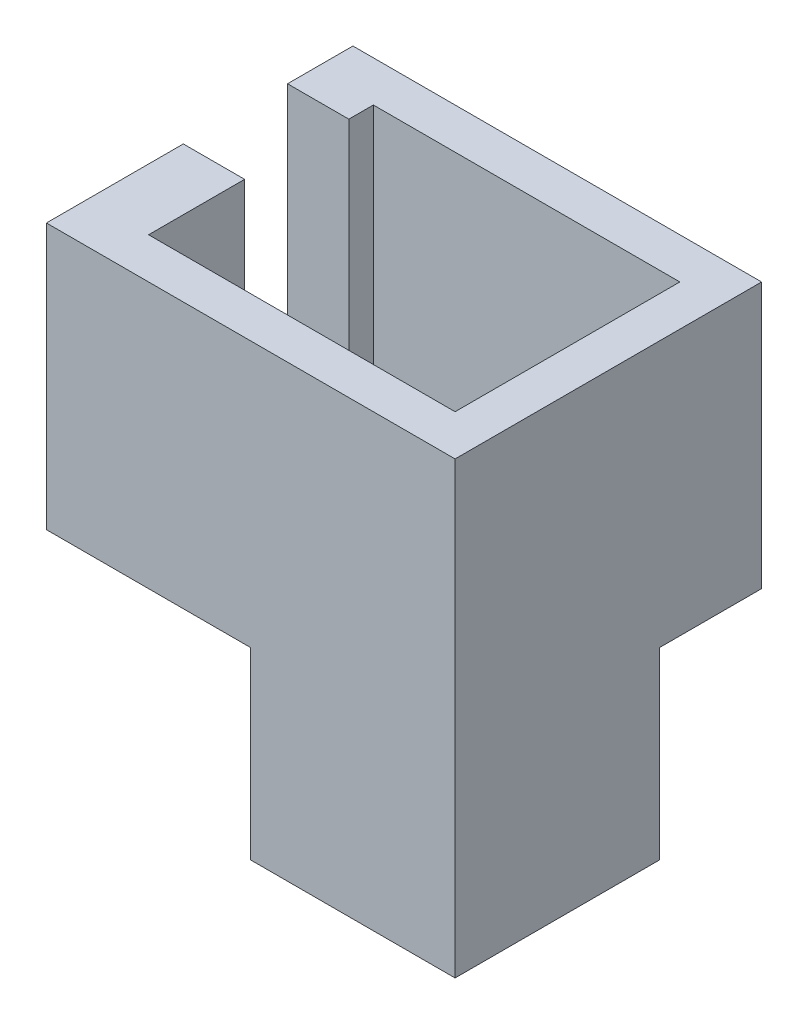
ISO-10303-21;
HEADER;
FILE_DESCRIPTION(('STEP AP214'),'2;1');
FILE_NAME('part.step','',(''),(''),'','','');
FILE_SCHEMA(('AUTOMOTIVE_DESIGN { 1 0 10303 214 1 1 1 1 }'));
ENDSEC;
DATA;
#1=APPLICATION_CONTEXT('core data for automotive mechanical design processes');
#2=APPLICATION_PROTOCOL_DEFINITION('international standard','automotive_design',2000,#1);
#3=PRODUCT_CONTEXT('',#1,'mechanical');
#4=PRODUCT('Part','Part','',(#3));
#5=PRODUCT_RELATED_PRODUCT_CATEGORY('part','',(#4));
#6=PRODUCT_DEFINITION_FORMATION('','',#4);
#7=PRODUCT_DEFINITION_CONTEXT('part definition',#1,'design');
#8=PRODUCT_DEFINITION('design','',#6,#7);
#9=PRODUCT_DEFINITION_SHAPE('','',#8);
#10=(LENGTH_UNIT() NAMED_UNIT(*) SI_UNIT(.MILLI.,.METRE.));
#11=(NAMED_UNIT(*) PLANE_ANGLE_UNIT() SI_UNIT($,.RADIAN.));
#12=(NAMED_UNIT(*) SI_UNIT($,.STERADIAN.) SOLID_ANGLE_UNIT());
#13=UNCERTAINTY_MEASURE_WITH_UNIT(LENGTH_MEASURE(1.E-05),#10,'distance_accuracy_value','');
#14=(GEOMETRIC_REPRESENTATION_CONTEXT(3) GLOBAL_UNCERTAINTY_ASSIGNED_CONTEXT((#13)) GLOBAL_UNIT_ASSIGNED_CONTEXT((#10,
#11,#12)) REPRESENTATION_CONTEXT('',''));
#15=CARTESIAN_POINT('',(0.,0.,0.));
#16=DIRECTION('',(0.,0.,1.));
#17=DIRECTION('',(1.,0.,0.));
#18=AXIS2_PLACEMENT_3D('',#15,#16,#17);
#19=CARTESIAN_POINT('',(0.,-1.,0.));
#20=DIRECTION('',(0.,1.,0.));
#21=DIRECTION('',(0.,0.,1.));
#22=AXIS2_PLACEMENT_3D('',#19,#20,#21);
#23=PLANE('',#22);
#24=DIRECTION('',(1.,0.,0.));
#25=VECTOR('',#24,1.);
#26=CARTESIAN_POINT('',(20.,-1.,-10.));
#27=LINE('',#26,#25);
#28=CARTESIAN_POINT('',(10.,-1.,-10.));
#29=VERTEX_POINT('',#28);
#30=CARTESIAN_POINT('',(20.,-1.,-10.));
#31=VERTEX_POINT('',#30);
#32=EDGE_CURVE('E162',#29,#31,#27,.T.);
#33=ORIENTED_EDGE('',*,*,#32,.F.);
#34=DIRECTION('',(0.,0.,-1.));
#35=VECTOR('',#34,1.);
#36=CARTESIAN_POINT('',(10.,-1.,0.));
#37=LINE('',#36,#35);
#38=CARTESIAN_POINT('',(10.,-1.,0.));
#39=VERTEX_POINT('',#38);
#40=EDGE_CURVE('E48',#39,#29,#37,.T.);
#41=ORIENTED_EDGE('',*,*,#40,.F.);
#42=DIRECTION('',(-1.,0.,0.));
#43=VECTOR('',#42,1.);
#44=CARTESIAN_POINT('',(20.,-1.,0.));
#45=LINE('',#44,#43);
#46=CARTESIAN_POINT('',(0.,-1.,0.));
#47=VERTEX_POINT('',#46);
#48=EDGE_CURVE('E177',#39,#47,#45,.T.);
#49=ORIENTED_EDGE('',*,*,#48,.T.);
#50=DIRECTION('',(0.,0.,-1.));
#51=VECTOR('',#50,1.);
#52=CARTESIAN_POINT('',(0.,-1.,0.));
#53=LINE('',#52,#51);
#54=CARTESIAN_POINT('',(0.,-1.,-15.));
#55=VERTEX_POINT('',#54);
#56=EDGE_CURVE('E179',#47,#55,#53,.T.);
#57=ORIENTED_EDGE('',*,*,#56,.T.);
#58=DIRECTION('',(1.,0.,0.));
#59=VECTOR('',#58,1.);
#60=CARTESIAN_POINT('',(20.,-1.,-15.));
#61=LINE('',#60,#59);
#62=CARTESIAN_POINT('',(20.,-1.,-15.));
#63=VERTEX_POINT('',#62);
#64=EDGE_CURVE('E182',#55,#63,#61,.T.);
#65=ORIENTED_EDGE('',*,*,#64,.T.);
#66=DIRECTION('',(0.,0.,1.));
#67=VECTOR('',#66,1.);
#68=CARTESIAN_POINT('',(20.,-1.,0.));
#69=LINE('',#68,#67);
#70=EDGE_CURVE('E54',#63,#31,#69,.T.);
#71=ORIENTED_EDGE('',*,*,#70,.T.);
#72=EDGE_LOOP('',(#33,#41,#49,#57,#65,#71));
#73=FACE_BOUND('',#72,.T.);
#74=ADVANCED_FACE('F33',(#73),#23,.F.);
#75=CARTESIAN_POINT('',(0.,12.,0.));
#76=DIRECTION('',(0.,0.,-1.));
#77=DIRECTION('',(-1.,0.,0.));
#78=AXIS2_PLACEMENT_3D('',#75,#76,#77);
#79=PLANE('',#78);
#80=DIRECTION('',(0.,-1.,0.));
#81=VECTOR('',#80,1.);
#82=CARTESIAN_POINT('',(0.,12.,0.));
#83=LINE('',#82,#81);
#84=CARTESIAN_POINT('',(0.,12.,0.));
#85=VERTEX_POINT('',#84);
#86=EDGE_CURVE('E11',#85,#47,#83,.T.);
#87=ORIENTED_EDGE('',*,*,#86,.T.);
#88=ORIENTED_EDGE('',*,*,#48,.F.);
#89=DIRECTION('',(0.,1.,0.));
#90=VECTOR('',#89,1.);
#91=CARTESIAN_POINT('',(10.,-10.,0.));
#92=LINE('',#91,#90);
#93=CARTESIAN_POINT('',(10.,-10.,0.));
#94=VERTEX_POINT('',#93);
#95=EDGE_CURVE('E153',#94,#39,#92,.T.);
#96=ORIENTED_EDGE('',*,*,#95,.F.);
#97=DIRECTION('',(-1.,0.,0.));
#98=VECTOR('',#97,1.);
#99=CARTESIAN_POINT('',(20.,-10.,0.));
#100=LINE('',#99,#98);
#101=CARTESIAN_POINT('',(20.,-10.,0.));
#102=VERTEX_POINT('',#101);
#103=EDGE_CURVE('E151',#102,#94,#100,.T.);
#104=ORIENTED_EDGE('',*,*,#103,.F.);
#105=DIRECTION('',(0.,-1.,0.));
#106=VECTOR('',#105,1.);
#107=CARTESIAN_POINT('',(20.,12.,0.));
#108=LINE('',#107,#106);
#109=CARTESIAN_POINT('',(20.,12.,0.));
#110=VERTEX_POINT('',#109);
#111=EDGE_CURVE('E41',#110,#102,#108,.T.);
#112=ORIENTED_EDGE('',*,*,#111,.F.);
#113=DIRECTION('',(1.,0.,0.));
#114=VECTOR('',#113,1.);
#115=CARTESIAN_POINT('',(0.,12.,0.));
#116=LINE('',#115,#114);
#117=EDGE_CURVE('E190',#85,#110,#116,.T.);
#118=ORIENTED_EDGE('',*,*,#117,.F.);
#119=EDGE_LOOP('',(#87,#88,#96,#104,#112,#118));
#120=FACE_BOUND('',#119,.T.);
#121=ADVANCED_FACE('F35',(#120),#79,.F.);
#122=CARTESIAN_POINT('',(20.,12.,0.));
#123=DIRECTION('',(-1.,0.,0.));
#124=DIRECTION('',(0.,0.,1.));
#125=AXIS2_PLACEMENT_3D('',#122,#123,#124);
#126=PLANE('',#125);
#127=ORIENTED_EDGE('',*,*,#111,.T.);
#128=DIRECTION('',(0.,0.,1.));
#129=VECTOR('',#128,1.);
#130=CARTESIAN_POINT('',(20.,-10.,0.));
#131=LINE('',#130,#129);
#132=CARTESIAN_POINT('',(20.,-10.,-10.));
#133=VERTEX_POINT('',#132);
#134=EDGE_CURVE('E145',#133,#102,#131,.T.);
#135=ORIENTED_EDGE('',*,*,#134,.F.);
#136=DIRECTION('',(0.,1.,0.));
#137=VECTOR('',#136,1.);
#138=CARTESIAN_POINT('',(20.,-10.,-10.));
#139=LINE('',#138,#137);
#140=EDGE_CURVE('E168',#133,#31,#139,.T.);
#141=ORIENTED_EDGE('',*,*,#140,.T.);
#142=ORIENTED_EDGE('',*,*,#70,.F.);
#143=DIRECTION('',(0.,-1.,0.));
#144=VECTOR('',#143,1.);
#145=CARTESIAN_POINT('',(20.,12.,-15.));
#146=LINE('',#145,#144);
#147=CARTESIAN_POINT('',(20.,12.,-15.));
#148=VERTEX_POINT('',#147);
#149=EDGE_CURVE('E149',#148,#63,#146,.T.);
#150=ORIENTED_EDGE('',*,*,#149,.F.);
#151=DIRECTION('',(0.,0.,-1.));
#152=VECTOR('',#151,1.);
#153=CARTESIAN_POINT('',(20.,12.,0.));
#154=LINE('',#153,#152);
#155=EDGE_CURVE('E147',#110,#148,#154,.T.);
#156=ORIENTED_EDGE('',*,*,#155,.F.);
#157=EDGE_LOOP('',(#127,#135,#141,#142,#150,#156));
#158=FACE_BOUND('',#157,.T.);
#159=ADVANCED_FACE('F142',(#158),#126,.F.);
#160=CARTESIAN_POINT('',(0.,12.,-15.));
#161=DIRECTION('',(0.,0.,1.));
#162=DIRECTION('',(1.,0.,0.));
#163=AXIS2_PLACEMENT_3D('',#160,#161,#162);
#164=PLANE('',#163);
#165=ORIENTED_EDGE('',*,*,#149,.T.);
#166=ORIENTED_EDGE('',*,*,#64,.F.);
#167=DIRECTION('',(0.,-1.,0.));
#168=VECTOR('',#167,1.);
#169=CARTESIAN_POINT('',(0.,12.,-15.));
#170=LINE('',#169,#168);
#171=CARTESIAN_POINT('',(0.,12.,-15.));
#172=VERTEX_POINT('',#171);
#173=EDGE_CURVE('E255',#172,#55,#170,.T.);
#174=ORIENTED_EDGE('',*,*,#173,.F.);
#175=DIRECTION('',(-1.,0.,0.));
#176=VECTOR('',#175,1.);
#177=CARTESIAN_POINT('',(0.,12.,-15.));
#178=LINE('',#177,#176);
#179=EDGE_CURVE('E194',#148,#172,#178,.T.);
#180=ORIENTED_EDGE('',*,*,#179,.F.);
#181=EDGE_LOOP('',(#165,#166,#174,#180));
#182=FACE_BOUND('',#181,.T.);
#183=ADVANCED_FACE('F260',(#182),#164,.F.);
#184=CARTESIAN_POINT('',(0.,12.,-15.));
#185=DIRECTION('',(1.,0.,0.));
#186=DIRECTION('',(0.,0.,-1.));
#187=AXIS2_PLACEMENT_3D('',#184,#185,#186);
#188=PLANE('',#187);
#189=ORIENTED_EDGE('',*,*,#173,.T.);
#190=ORIENTED_EDGE('',*,*,#56,.F.);
#191=ORIENTED_EDGE('',*,*,#86,.F.);
#192=DIRECTION('',(0.,0.,1.));
#193=VECTOR('',#192,1.);
#194=CARTESIAN_POINT('',(0.,12.,0.));
#195=LINE('',#194,#193);
#196=CARTESIAN_POINT('',(0.,12.,-6.7));
#197=VERTEX_POINT('',#196);
#198=EDGE_CURVE('E187',#197,#85,#195,.T.);
#199=ORIENTED_EDGE('',*,*,#198,.F.);
#200=DIRECTION('',(0.,-1.,0.));
#201=VECTOR('',#200,1.);
#202=CARTESIAN_POINT('',(0.,12.,-6.7));
#203=LINE('',#202,#201);
#204=CARTESIAN_POINT('',(0.,0.,-6.7));
#205=VERTEX_POINT('',#204);
#206=EDGE_CURVE('E212',#197,#205,#203,.T.);
#207=ORIENTED_EDGE('',*,*,#206,.T.);
#208=DIRECTION('',(0.,0.,-1.));
#209=VECTOR('',#208,1.);
#210=CARTESIAN_POINT('',(0.,0.,0.));
#211=LINE('',#210,#209);
#212=CARTESIAN_POINT('',(0.,0.,-11.8));
#213=VERTEX_POINT('',#212);
#214=EDGE_CURVE('E175',#205,#213,#211,.T.);
#215=ORIENTED_EDGE('',*,*,#214,.T.);
#216=DIRECTION('',(0.,-1.,0.));
#217=VECTOR('',#216,1.);
#218=CARTESIAN_POINT('',(0.,12.,-11.8));
#219=LINE('',#218,#217);
#220=CARTESIAN_POINT('',(0.,12.,-11.8));
#221=VERTEX_POINT('',#220);
#222=EDGE_CURVE('E252',#221,#213,#219,.T.);
#223=ORIENTED_EDGE('',*,*,#222,.F.);
#224=DIRECTION('',(0.,0.,1.));
#225=VECTOR('',#224,1.);
#226=CARTESIAN_POINT('',(0.,12.,-15.));
#227=LINE('',#226,#225);
#228=EDGE_CURVE('E196',#172,#221,#227,.T.);
#229=ORIENTED_EDGE('',*,*,#228,.F.);
#230=EDGE_LOOP('',(#189,#190,#191,#199,#207,#215,#223,#229));
#231=FACE_BOUND('',#230,.T.);
#232=ADVANCED_FACE('F318',(#231),#188,.F.);
#233=CARTESIAN_POINT('',(0.,12.,-11.8));
#234=DIRECTION('',(0.,0.,-1.));
#235=DIRECTION('',(-1.,0.,0.));
#236=AXIS2_PLACEMENT_3D('',#233,#234,#235);
#237=PLANE('',#236);
#238=DIRECTION('',(1.,0.,0.));
#239=VECTOR('',#238,1.);
#240=CARTESIAN_POINT('',(0.,0.,-11.8));
#241=LINE('',#240,#239);
#242=CARTESIAN_POINT('',(3.,0.,-11.8));
#243=VERTEX_POINT('',#242);
#244=EDGE_CURVE('E184',#213,#243,#241,.T.);
#245=ORIENTED_EDGE('',*,*,#244,.T.);
#246=DIRECTION('',(0.,-1.,0.));
#247=VECTOR('',#246,1.);
#248=CARTESIAN_POINT('',(3.,12.,-11.8));
#249=LINE('',#248,#247);
#250=CARTESIAN_POINT('',(3.,12.,-11.8));
#251=VERTEX_POINT('',#250);
#252=EDGE_CURVE('E249',#251,#243,#249,.T.);
#253=ORIENTED_EDGE('',*,*,#252,.F.);
#254=DIRECTION('',(1.,0.,0.));
#255=VECTOR('',#254,1.);
#256=CARTESIAN_POINT('',(0.,12.,-11.8));
#257=LINE('',#256,#255);
#258=EDGE_CURVE('E198',#221,#251,#257,.T.);
#259=ORIENTED_EDGE('',*,*,#258,.F.);
#260=ORIENTED_EDGE('',*,*,#222,.T.);
#261=EDGE_LOOP('',(#245,#253,#259,#260));
#262=FACE_BOUND('',#261,.T.);
#263=ADVANCED_FACE('F314',(#262),#237,.F.);
#264=CARTESIAN_POINT('',(3.,12.,-11.8));
#265=DIRECTION('',(-1.,0.,0.));
#266=DIRECTION('',(0.,0.,1.));
#267=AXIS2_PLACEMENT_3D('',#264,#265,#266);
#268=PLANE('',#267);
#269=DIRECTION('',(0.,0.,-1.));
#270=VECTOR('',#269,1.);
#271=CARTESIAN_POINT('',(3.,0.,-11.8));
#272=LINE('',#271,#270);
#273=CARTESIAN_POINT('',(3.,0.,-13.));
#274=VERTEX_POINT('',#273);
#275=EDGE_CURVE('E215',#243,#274,#272,.T.);
#276=ORIENTED_EDGE('',*,*,#275,.T.);
#277=DIRECTION('',(0.,-1.,0.));
#278=VECTOR('',#277,1.);
#279=CARTESIAN_POINT('',(3.,12.,-13.));
#280=LINE('',#279,#278);
#281=CARTESIAN_POINT('',(3.,12.,-13.));
#282=VERTEX_POINT('',#281);
#283=EDGE_CURVE('E246',#282,#274,#280,.T.);
#284=ORIENTED_EDGE('',*,*,#283,.F.);
#285=DIRECTION('',(0.,0.,-1.));
#286=VECTOR('',#285,1.);
#287=CARTESIAN_POINT('',(3.,12.,-11.8));
#288=LINE('',#287,#286);
#289=EDGE_CURVE('E200',#251,#282,#288,.T.);
#290=ORIENTED_EDGE('',*,*,#289,.F.);
#291=ORIENTED_EDGE('',*,*,#252,.T.);
#292=EDGE_LOOP('',(#276,#284,#290,#291));
#293=FACE_BOUND('',#292,.T.);
#294=ADVANCED_FACE('F310',(#293),#268,.F.);
#295=CARTESIAN_POINT('',(18.,12.,-13.));
#296=DIRECTION('',(0.,0.,-1.));
#297=DIRECTION('',(-1.,0.,0.));
#298=AXIS2_PLACEMENT_3D('',#295,#296,#297);
#299=PLANE('',#298);
#300=DIRECTION('',(1.,0.,0.));
#301=VECTOR('',#300,1.);
#302=CARTESIAN_POINT('',(18.,0.,-13.));
#303=LINE('',#302,#301);
#304=CARTESIAN_POINT('',(18.,0.,-13.));
#305=VERTEX_POINT('',#304);
#306=EDGE_CURVE('E218',#274,#305,#303,.T.);
#307=ORIENTED_EDGE('',*,*,#306,.T.);
#308=DIRECTION('',(0.,-1.,0.));
#309=VECTOR('',#308,1.);
#310=CARTESIAN_POINT('',(18.,12.,-13.));
#311=LINE('',#310,#309);
#312=CARTESIAN_POINT('',(18.,12.,-13.));
#313=VERTEX_POINT('',#312);
#314=EDGE_CURVE('E243',#313,#305,#311,.T.);
#315=ORIENTED_EDGE('',*,*,#314,.F.);
#316=DIRECTION('',(1.,0.,0.));
#317=VECTOR('',#316,1.);
#318=CARTESIAN_POINT('',(18.,12.,-13.));
#319=LINE('',#318,#317);
#320=EDGE_CURVE('E202',#282,#313,#319,.T.);
#321=ORIENTED_EDGE('',*,*,#320,.F.);
#322=ORIENTED_EDGE('',*,*,#283,.T.);
#323=EDGE_LOOP('',(#307,#315,#321,#322));
#324=FACE_BOUND('',#323,.T.);
#325=ADVANCED_FACE('F306',(#324),#299,.F.);
#326=CARTESIAN_POINT('',(18.,12.,-2.));
#327=DIRECTION('',(1.,0.,0.));
#328=DIRECTION('',(0.,0.,-1.));
#329=AXIS2_PLACEMENT_3D('',#326,#327,#328);
#330=PLANE('',#329);
#331=DIRECTION('',(0.,0.,1.));
#332=VECTOR('',#331,1.);
#333=CARTESIAN_POINT('',(18.,0.,-2.));
#334=LINE('',#333,#332);
#335=CARTESIAN_POINT('',(18.,0.,-2.));
#336=VERTEX_POINT('',#335);
#337=EDGE_CURVE('E221',#305,#336,#334,.T.);
#338=ORIENTED_EDGE('',*,*,#337,.T.);
#339=DIRECTION('',(0.,-1.,0.));
#340=VECTOR('',#339,1.);
#341=CARTESIAN_POINT('',(18.,12.,-2.));
#342=LINE('',#341,#340);
#343=CARTESIAN_POINT('',(18.,12.,-2.));
#344=VERTEX_POINT('',#343);
#345=EDGE_CURVE('E240',#344,#336,#342,.T.);
#346=ORIENTED_EDGE('',*,*,#345,.F.);
#347=DIRECTION('',(0.,0.,1.));
#348=VECTOR('',#347,1.);
#349=CARTESIAN_POINT('',(18.,12.,-2.));
#350=LINE('',#349,#348);
#351=EDGE_CURVE('E204',#313,#344,#350,.T.);
#352=ORIENTED_EDGE('',*,*,#351,.F.);
#353=ORIENTED_EDGE('',*,*,#314,.T.);
#354=EDGE_LOOP('',(#338,#346,#352,#353));
#355=FACE_BOUND('',#354,.T.);
#356=ADVANCED_FACE('F302',(#355),#330,.F.);
#357=CARTESIAN_POINT('',(3.,12.,-2.));
#358=DIRECTION('',(0.,0.,1.));
#359=DIRECTION('',(1.,0.,0.));
#360=AXIS2_PLACEMENT_3D('',#357,#358,#359);
#361=PLANE('',#360);
#362=DIRECTION('',(-1.,0.,0.));
#363=VECTOR('',#362,1.);
#364=CARTESIAN_POINT('',(3.,0.,-2.));
#365=LINE('',#364,#363);
#366=CARTESIAN_POINT('',(3.,0.,-2.));
#367=VERTEX_POINT('',#366);
#368=EDGE_CURVE('E224',#336,#367,#365,.T.);
#369=ORIENTED_EDGE('',*,*,#368,.T.);
#370=DIRECTION('',(0.,-1.,0.));
#371=VECTOR('',#370,1.);
#372=CARTESIAN_POINT('',(3.,12.,-2.));
#373=LINE('',#372,#371);
#374=CARTESIAN_POINT('',(3.,12.,-2.));
#375=VERTEX_POINT('',#374);
#376=EDGE_CURVE('E237',#375,#367,#373,.T.);
#377=ORIENTED_EDGE('',*,*,#376,.F.);
#378=DIRECTION('',(-1.,0.,0.));
#379=VECTOR('',#378,1.);
#380=CARTESIAN_POINT('',(3.,12.,-2.));
#381=LINE('',#380,#379);
#382=EDGE_CURVE('E206',#344,#375,#381,.T.);
#383=ORIENTED_EDGE('',*,*,#382,.F.);
#384=ORIENTED_EDGE('',*,*,#345,.T.);
#385=EDGE_LOOP('',(#369,#377,#383,#384));
#386=FACE_BOUND('',#385,.T.);
#387=ADVANCED_FACE('F298',(#386),#361,.F.);
#388=CARTESIAN_POINT('',(3.,12.,-2.));
#389=DIRECTION('',(-1.,0.,0.));
#390=DIRECTION('',(0.,0.,1.));
#391=AXIS2_PLACEMENT_3D('',#388,#389,#390);
#392=PLANE('',#391);
#393=DIRECTION('',(0.,0.,-1.));
#394=VECTOR('',#393,1.);
#395=CARTESIAN_POINT('',(3.,0.,-2.));
#396=LINE('',#395,#394);
#397=CARTESIAN_POINT('',(3.,0.,-6.7));
#398=VERTEX_POINT('',#397);
#399=EDGE_CURVE('E227',#367,#398,#396,.T.);
#400=ORIENTED_EDGE('',*,*,#399,.T.);
#401=DIRECTION('',(0.,-1.,0.));
#402=VECTOR('',#401,1.);
#403=CARTESIAN_POINT('',(3.,12.,-6.7));
#404=LINE('',#403,#402);
#405=CARTESIAN_POINT('',(3.,12.,-6.7));
#406=VERTEX_POINT('',#405);
#407=EDGE_CURVE('E234',#406,#398,#404,.T.);
#408=ORIENTED_EDGE('',*,*,#407,.F.);
#409=DIRECTION('',(0.,0.,-1.));
#410=VECTOR('',#409,1.);
#411=CARTESIAN_POINT('',(3.,12.,-2.));
#412=LINE('',#411,#410);
#413=EDGE_CURVE('E208',#375,#406,#412,.T.);
#414=ORIENTED_EDGE('',*,*,#413,.F.);
#415=ORIENTED_EDGE('',*,*,#376,.T.);
#416=EDGE_LOOP('',(#400,#408,#414,#415));
#417=FACE_BOUND('',#416,.T.);
#418=ADVANCED_FACE('F294',(#417),#392,.F.);
#419=CARTESIAN_POINT('',(0.,12.,-6.7));
#420=DIRECTION('',(0.,0.,1.));
#421=DIRECTION('',(1.,0.,0.));
#422=AXIS2_PLACEMENT_3D('',#419,#420,#421);
#423=PLANE('',#422);
#424=DIRECTION('',(-1.,0.,0.));
#425=VECTOR('',#424,1.);
#426=CARTESIAN_POINT('',(0.,0.,-6.7));
#427=LINE('',#426,#425);
#428=EDGE_CURVE('E191',#398,#205,#427,.T.);
#429=ORIENTED_EDGE('',*,*,#428,.T.);
#430=ORIENTED_EDGE('',*,*,#206,.F.);
#431=DIRECTION('',(-1.,0.,0.));
#432=VECTOR('',#431,1.);
#433=CARTESIAN_POINT('',(0.,12.,-6.7));
#434=LINE('',#433,#432);
#435=EDGE_CURVE('E210',#406,#197,#434,.T.);
#436=ORIENTED_EDGE('',*,*,#435,.F.);
#437=ORIENTED_EDGE('',*,*,#407,.T.);
#438=EDGE_LOOP('',(#429,#430,#436,#437));
#439=FACE_BOUND('',#438,.T.);
#440=ADVANCED_FACE('F290',(#439),#423,.F.);
#441=CARTESIAN_POINT('',(0.,12.,0.));
#442=DIRECTION('',(0.,-1.,0.));
#443=DIRECTION('',(0.,0.,-1.));
#444=AXIS2_PLACEMENT_3D('',#441,#442,#443);
#445=PLANE('',#444);
#446=ORIENTED_EDGE('',*,*,#198,.T.);
#447=ORIENTED_EDGE('',*,*,#117,.T.);
#448=ORIENTED_EDGE('',*,*,#155,.T.);
#449=ORIENTED_EDGE('',*,*,#179,.T.);
#450=ORIENTED_EDGE('',*,*,#228,.T.);
#451=ORIENTED_EDGE('',*,*,#258,.T.);
#452=ORIENTED_EDGE('',*,*,#289,.T.);
#453=ORIENTED_EDGE('',*,*,#320,.T.);
#454=ORIENTED_EDGE('',*,*,#351,.T.);
#455=ORIENTED_EDGE('',*,*,#382,.T.);
#456=ORIENTED_EDGE('',*,*,#413,.T.);
#457=ORIENTED_EDGE('',*,*,#435,.T.);
#458=EDGE_LOOP('',(#446,#447,#448,#449,#450,#451,#452,#453,#454,#455,#456,#457));
#459=FACE_BOUND('',#458,.T.);
#460=ADVANCED_FACE('F277',(#459),#445,.F.);
#461=CARTESIAN_POINT('',(0.,0.,0.));
#462=DIRECTION('',(0.,1.,0.));
#463=DIRECTION('',(0.,0.,1.));
#464=AXIS2_PLACEMENT_3D('',#461,#462,#463);
#465=PLANE('',#464);
#466=ORIENTED_EDGE('',*,*,#428,.F.);
#467=ORIENTED_EDGE('',*,*,#399,.F.);
#468=ORIENTED_EDGE('',*,*,#368,.F.);
#469=ORIENTED_EDGE('',*,*,#337,.F.);
#470=ORIENTED_EDGE('',*,*,#306,.F.);
#471=ORIENTED_EDGE('',*,*,#275,.F.);
#472=ORIENTED_EDGE('',*,*,#244,.F.);
#473=ORIENTED_EDGE('',*,*,#214,.F.);
#474=EDGE_LOOP('',(#466,#467,#468,#469,#470,#471,#472,#473));
#475=FACE_BOUND('',#474,.T.);
#476=ADVANCED_FACE('F269',(#475),#465,.T.);
#477=CARTESIAN_POINT('',(10.,-10.,0.));
#478=DIRECTION('',(1.,0.,0.));
#479=DIRECTION('',(0.,0.,-1.));
#480=AXIS2_PLACEMENT_3D('',#477,#478,#479);
#481=PLANE('',#480);
#482=ORIENTED_EDGE('',*,*,#40,.T.);
#483=DIRECTION('',(0.,1.,0.));
#484=VECTOR('',#483,1.);
#485=CARTESIAN_POINT('',(10.,-10.,-10.));
#486=LINE('',#485,#484);
#487=CARTESIAN_POINT('',(10.,-10.,-10.));
#488=VERTEX_POINT('',#487);
#489=EDGE_CURVE('E171',#488,#29,#486,.T.);
#490=ORIENTED_EDGE('',*,*,#489,.F.);
#491=DIRECTION('',(0.,0.,-1.));
#492=VECTOR('',#491,1.);
#493=CARTESIAN_POINT('',(10.,-10.,0.));
#494=LINE('',#493,#492);
#495=EDGE_CURVE('E156',#94,#488,#494,.T.);
#496=ORIENTED_EDGE('',*,*,#495,.F.);
#497=ORIENTED_EDGE('',*,*,#95,.T.);
#498=EDGE_LOOP('',(#482,#490,#496,#497));
#499=FACE_BOUND('',#498,.T.);
#500=ADVANCED_FACE('F267',(#499),#481,.F.);
#501=CARTESIAN_POINT('',(20.,-10.,-10.));
#502=DIRECTION('',(0.,0.,1.));
#503=DIRECTION('',(1.,0.,0.));
#504=AXIS2_PLACEMENT_3D('',#501,#502,#503);
#505=PLANE('',#504);
#506=ORIENTED_EDGE('',*,*,#32,.T.);
#507=ORIENTED_EDGE('',*,*,#140,.F.);
#508=DIRECTION('',(1.,0.,0.));
#509=VECTOR('',#508,1.);
#510=CARTESIAN_POINT('',(20.,-10.,-10.));
#511=LINE('',#510,#509);
#512=EDGE_CURVE('E160',#488,#133,#511,.T.);
#513=ORIENTED_EDGE('',*,*,#512,.F.);
#514=ORIENTED_EDGE('',*,*,#489,.T.);
#515=EDGE_LOOP('',(#506,#507,#513,#514));
#516=FACE_BOUND('',#515,.T.);
#517=ADVANCED_FACE('F264',(#516),#505,.F.);
#518=CARTESIAN_POINT('',(0.,-10.,0.));
#519=DIRECTION('',(0.,1.,0.));
#520=DIRECTION('',(0.,0.,1.));
#521=AXIS2_PLACEMENT_3D('',#518,#519,#520);
#522=PLANE('',#521);
#523=ORIENTED_EDGE('',*,*,#134,.T.);
#524=ORIENTED_EDGE('',*,*,#103,.T.);
#525=ORIENTED_EDGE('',*,*,#495,.T.);
#526=ORIENTED_EDGE('',*,*,#512,.T.);
#527=EDGE_LOOP('',(#523,#524,#525,#526));
#528=FACE_BOUND('',#527,.T.);
#529=ADVANCED_FACE('F158',(#528),#522,.F.);
#530=CLOSED_SHELL('',(#74,#121,#159,#183,#232,#263,#294,#325,#356,#387,#418,#440,#460,#476,#500,
#517,#529));
#531=MANIFOLD_SOLID_BREP('B2',#530);
#532=ADVANCED_BREP_SHAPE_REPRESENTATION('',(#18,#531),#14);
#533=SHAPE_DEFINITION_REPRESENTATION(#9,#532);
ENDSEC;
END-ISO-10303-21;
